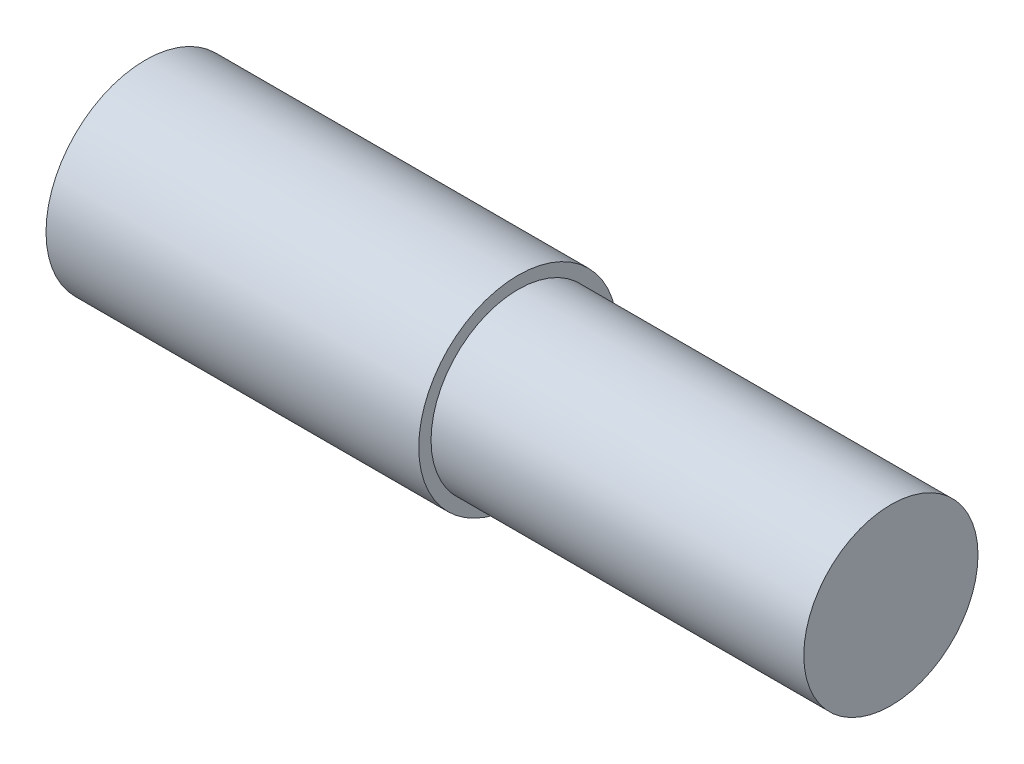
ISO-10303-21;
HEADER;
FILE_DESCRIPTION(('STEP AP214'),'2;1');
FILE_NAME('part.step','',(''),(''),'','','');
FILE_SCHEMA(('AUTOMOTIVE_DESIGN { 1 0 10303 214 1 1 1 1 }'));
ENDSEC;
DATA;
#1=APPLICATION_CONTEXT('core data for automotive mechanical design processes');
#2=APPLICATION_PROTOCOL_DEFINITION('international standard','automotive_design',2000,#1);
#3=PRODUCT_CONTEXT('',#1,'mechanical');
#4=PRODUCT('Part','Part','',(#3));
#5=PRODUCT_RELATED_PRODUCT_CATEGORY('part','',(#4));
#6=PRODUCT_DEFINITION_FORMATION('','',#4);
#7=PRODUCT_DEFINITION_CONTEXT('part definition',#1,'design');
#8=PRODUCT_DEFINITION('design','',#6,#7);
#9=PRODUCT_DEFINITION_SHAPE('','',#8);
#10=(LENGTH_UNIT() NAMED_UNIT(*) SI_UNIT(.MILLI.,.METRE.));
#11=(NAMED_UNIT(*) PLANE_ANGLE_UNIT() SI_UNIT($,.RADIAN.));
#12=(NAMED_UNIT(*) SI_UNIT($,.STERADIAN.) SOLID_ANGLE_UNIT());
#13=UNCERTAINTY_MEASURE_WITH_UNIT(LENGTH_MEASURE(1.E-05),#10,'distance_accuracy_value','');
#14=(GEOMETRIC_REPRESENTATION_CONTEXT(3) GLOBAL_UNCERTAINTY_ASSIGNED_CONTEXT((#13)) GLOBAL_UNIT_ASSIGNED_CONTEXT((#10,
#11,#12)) REPRESENTATION_CONTEXT('',''));
#15=CARTESIAN_POINT('',(0.,0.,0.));
#16=DIRECTION('',(0.,0.,1.));
#17=DIRECTION('',(1.,0.,0.));
#18=AXIS2_PLACEMENT_3D('',#15,#16,#17);
#19=CARTESIAN_POINT('',(15.,0.,0.));
#20=DIRECTION('',(-1.,0.,0.));
#21=DIRECTION('',(0.,0.,1.));
#22=AXIS2_PLACEMENT_3D('',#19,#20,#21);
#23=CYLINDRICAL_SURFACE('',#22,4.);
#24=CARTESIAN_POINT('',(15.,0.,0.));
#25=DIRECTION('',(1.,0.,0.));
#26=DIRECTION('',(0.,0.,-1.));
#27=AXIS2_PLACEMENT_3D('',#24,#25,#26);
#28=CIRCLE('',#27,4.);
#29=CARTESIAN_POINT('',(15.,0.,-4.));
#30=VERTEX_POINT('',#29);
#31=EDGE_CURVE('E49',#30,#30,#28,.T.);
#32=ORIENTED_EDGE('',*,*,#31,.F.);
#33=EDGE_LOOP('',(#32));
#34=FACE_BOUND('',#33,.T.);
#35=CARTESIAN_POINT('',(0.,0.,0.));
#36=DIRECTION('',(1.,0.,0.));
#37=DIRECTION('',(0.,0.,-1.));
#38=AXIS2_PLACEMENT_3D('',#35,#36,#37);
#39=CIRCLE('',#38,4.);
#40=CARTESIAN_POINT('',(0.,0.,-4.));
#41=VERTEX_POINT('',#40);
#42=EDGE_CURVE('E44',#41,#41,#39,.T.);
#43=ORIENTED_EDGE('',*,*,#42,.T.);
#44=EDGE_LOOP('',(#43));
#45=FACE_BOUND('',#44,.T.);
#46=ADVANCED_FACE('F41',(#34,#45),#23,.T.);
#47=CARTESIAN_POINT('',(15.,0.,0.));
#48=DIRECTION('',(1.,0.,0.));
#49=DIRECTION('',(0.,0.,-1.));
#50=AXIS2_PLACEMENT_3D('',#47,#48,#49);
#51=PLANE('',#50);
#52=CARTESIAN_POINT('',(15.,0.,0.));
#53=DIRECTION('',(1.,0.,0.));
#54=DIRECTION('',(0.,0.,-1.));
#55=AXIS2_PLACEMENT_3D('',#52,#53,#54);
#56=CIRCLE('',#55,3.5052);
#57=CARTESIAN_POINT('',(15.,0.,-3.5052));
#58=VERTEX_POINT('',#57);
#59=EDGE_CURVE('E10',#58,#58,#56,.T.);
#60=ORIENTED_EDGE('',*,*,#59,.F.);
#61=EDGE_LOOP('',(#60));
#62=FACE_BOUND('',#61,.T.);
#63=ORIENTED_EDGE('',*,*,#31,.T.);
#64=EDGE_LOOP('',(#63));
#65=FACE_BOUND('',#64,.T.);
#66=ADVANCED_FACE('F69',(#62,#65),#51,.T.);
#67=CARTESIAN_POINT('',(0.,0.,0.));
#68=DIRECTION('',(1.,0.,0.));
#69=DIRECTION('',(0.,0.,-1.));
#70=AXIS2_PLACEMENT_3D('',#67,#68,#69);
#71=PLANE('',#70);
#72=ORIENTED_EDGE('',*,*,#42,.F.);
#73=EDGE_LOOP('',(#72));
#74=FACE_BOUND('',#73,.T.);
#75=ADVANCED_FACE('F66',(#74),#71,.F.);
#76=CARTESIAN_POINT('',(30.,0.,0.));
#77=DIRECTION('',(-1.,0.,0.));
#78=DIRECTION('',(0.,0.,1.));
#79=AXIS2_PLACEMENT_3D('',#76,#77,#78);
#80=CYLINDRICAL_SURFACE('',#79,3.5052);
#81=CARTESIAN_POINT('',(30.,0.,0.));
#82=DIRECTION('',(1.,0.,0.));
#83=DIRECTION('',(0.,0.,-1.));
#84=AXIS2_PLACEMENT_3D('',#81,#82,#83);
#85=CIRCLE('',#84,3.5052);
#86=CARTESIAN_POINT('',(30.,0.,-3.5052));
#87=VERTEX_POINT('',#86);
#88=EDGE_CURVE('E56',#87,#87,#85,.T.);
#89=ORIENTED_EDGE('',*,*,#88,.F.);
#90=EDGE_LOOP('',(#89));
#91=FACE_BOUND('',#90,.T.);
#92=ORIENTED_EDGE('',*,*,#59,.T.);
#93=EDGE_LOOP('',(#92));
#94=FACE_BOUND('',#93,.T.);
#95=ADVANCED_FACE('F68',(#91,#94),#80,.T.);
#96=CARTESIAN_POINT('',(30.,0.,0.));
#97=DIRECTION('',(1.,0.,0.));
#98=DIRECTION('',(0.,0.,-1.));
#99=AXIS2_PLACEMENT_3D('',#96,#97,#98);
#100=PLANE('',#99);
#101=ORIENTED_EDGE('',*,*,#88,.T.);
#102=EDGE_LOOP('',(#101));
#103=FACE_BOUND('',#102,.T.);
#104=ADVANCED_FACE('F74',(#103),#100,.T.);
#105=CLOSED_SHELL('',(#46,#66,#75,#95,#104));
#106=MANIFOLD_SOLID_BREP('B2',#105);
#107=ADVANCED_BREP_SHAPE_REPRESENTATION('',(#18,#106),#14);
#108=SHAPE_DEFINITION_REPRESENTATION(#9,#107);
ENDSEC;
END-ISO-10303-21;
